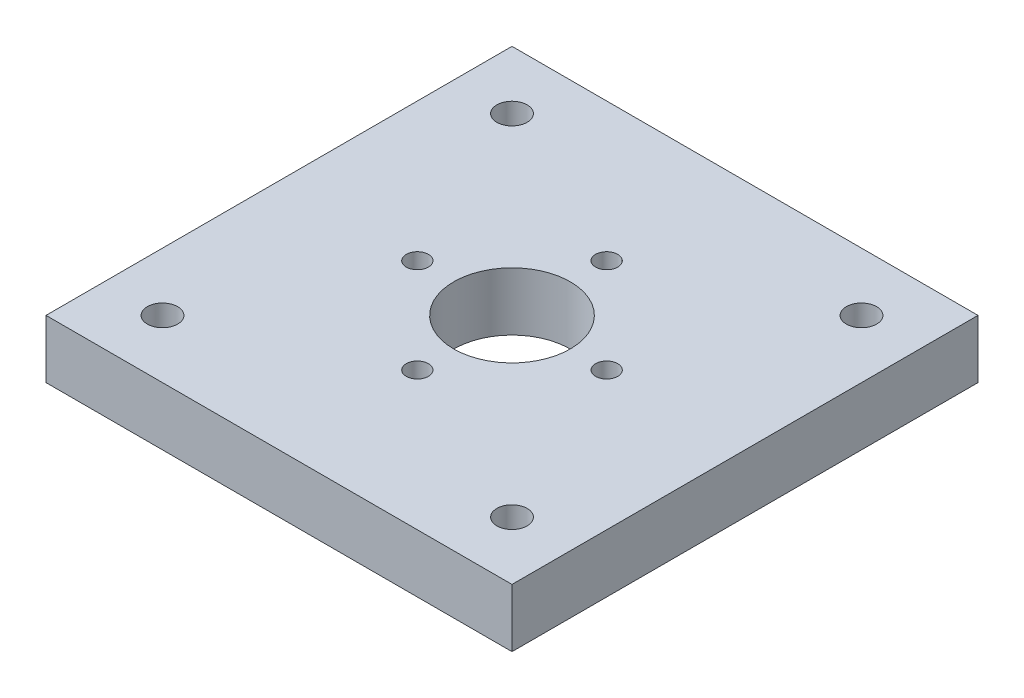
ISO-10303-21;
HEADER;
FILE_DESCRIPTION(('STEP AP214'),'2;1');
FILE_NAME('part.step','',(''),(''),'','','');
FILE_SCHEMA(('AUTOMOTIVE_DESIGN { 1 0 10303 214 1 1 1 1 }'));
ENDSEC;
DATA;
#1=APPLICATION_CONTEXT('core data for automotive mechanical design processes');
#2=APPLICATION_PROTOCOL_DEFINITION('international standard','automotive_design',2000,#1);
#3=PRODUCT_CONTEXT('',#1,'mechanical');
#4=PRODUCT('Part','Part','',(#3));
#5=PRODUCT_RELATED_PRODUCT_CATEGORY('part','',(#4));
#6=PRODUCT_DEFINITION_FORMATION('','',#4);
#7=PRODUCT_DEFINITION_CONTEXT('part definition',#1,'design');
#8=PRODUCT_DEFINITION('design','',#6,#7);
#9=PRODUCT_DEFINITION_SHAPE('','',#8);
#10=(LENGTH_UNIT() NAMED_UNIT(*) SI_UNIT(.MILLI.,.METRE.));
#11=(NAMED_UNIT(*) PLANE_ANGLE_UNIT() SI_UNIT($,.RADIAN.));
#12=(NAMED_UNIT(*) SI_UNIT($,.STERADIAN.) SOLID_ANGLE_UNIT());
#13=UNCERTAINTY_MEASURE_WITH_UNIT(LENGTH_MEASURE(1.E-05),#10,'distance_accuracy_value','');
#14=(GEOMETRIC_REPRESENTATION_CONTEXT(3) GLOBAL_UNCERTAINTY_ASSIGNED_CONTEXT((#13)) GLOBAL_UNIT_ASSIGNED_CONTEXT((#10,
#11,#12)) REPRESENTATION_CONTEXT('',''));
#15=CARTESIAN_POINT('',(0.,0.,0.));
#16=DIRECTION('',(0.,0.,1.));
#17=DIRECTION('',(1.,0.,0.));
#18=AXIS2_PLACEMENT_3D('',#15,#16,#17);
#19=CARTESIAN_POINT('',(0.,6.35,0.));
#20=DIRECTION('',(0.,-1.,0.));
#21=DIRECTION('',(0.,0.,-1.));
#22=AXIS2_PLACEMENT_3D('',#19,#20,#21);
#23=PLANE('',#22);
#24=DIRECTION('',(0.,0.,-1.));
#25=VECTOR('',#24,1.);
#26=CARTESIAN_POINT('',(50.8,6.35,50.8));
#27=LINE('',#26,#25);
#28=CARTESIAN_POINT('',(50.8,6.35,50.8));
#29=VERTEX_POINT('',#28);
#30=CARTESIAN_POINT('',(50.8,6.35,-50.8));
#31=VERTEX_POINT('',#30);
#32=EDGE_CURVE('E94',#29,#31,#27,.T.);
#33=ORIENTED_EDGE('',*,*,#32,.T.);
#34=DIRECTION('',(-1.,0.,0.));
#35=VECTOR('',#34,1.);
#36=CARTESIAN_POINT('',(-50.8,6.35,-50.8));
#37=LINE('',#36,#35);
#38=CARTESIAN_POINT('',(-50.8,6.35,-50.8));
#39=VERTEX_POINT('',#38);
#40=EDGE_CURVE('E89',#31,#39,#37,.T.);
#41=ORIENTED_EDGE('',*,*,#40,.T.);
#42=DIRECTION('',(0.,0.,1.));
#43=VECTOR('',#42,1.);
#44=CARTESIAN_POINT('',(-50.8,6.35,50.8));
#45=LINE('',#44,#43);
#46=CARTESIAN_POINT('',(-50.8,6.35,50.8));
#47=VERTEX_POINT('',#46);
#48=EDGE_CURVE('E92',#39,#47,#45,.T.);
#49=ORIENTED_EDGE('',*,*,#48,.T.);
#50=DIRECTION('',(1.,0.,0.));
#51=VECTOR('',#50,1.);
#52=CARTESIAN_POINT('',(-50.8,6.35,50.8));
#53=LINE('',#52,#51);
#54=EDGE_CURVE('E59',#47,#29,#53,.T.);
#55=ORIENTED_EDGE('',*,*,#54,.T.);
#56=EDGE_LOOP('',(#33,#41,#49,#55));
#57=FACE_BOUND('',#56,.T.);
#58=CARTESIAN_POINT('',(-38.1,6.35,-38.1));
#59=DIRECTION('',(0.,1.,0.));
#60=DIRECTION('',(0.,0.,1.));
#61=AXIS2_PLACEMENT_3D('',#58,#59,#60);
#62=CIRCLE('',#61,3.302);
#63=CARTESIAN_POINT('',(-38.1,6.35,-34.798));
#64=VERTEX_POINT('',#63);
#65=EDGE_CURVE('E109',#64,#64,#62,.T.);
#66=ORIENTED_EDGE('',*,*,#65,.F.);
#67=EDGE_LOOP('',(#66));
#68=FACE_BOUND('',#67,.T.);
#69=CARTESIAN_POINT('',(-38.1,6.35,38.1));
#70=DIRECTION('',(0.,1.,0.));
#71=DIRECTION('',(0.,0.,-1.));
#72=AXIS2_PLACEMENT_3D('',#69,#70,#71);
#73=CIRCLE('',#72,3.302);
#74=CARTESIAN_POINT('',(-38.1,6.35,34.798));
#75=VERTEX_POINT('',#74);
#76=EDGE_CURVE('E124',#75,#75,#73,.T.);
#77=ORIENTED_EDGE('',*,*,#76,.F.);
#78=EDGE_LOOP('',(#77));
#79=FACE_BOUND('',#78,.T.);
#80=CARTESIAN_POINT('',(38.1,6.35,38.1));
#81=DIRECTION('',(0.,1.,0.));
#82=DIRECTION('',(0.,0.,1.));
#83=AXIS2_PLACEMENT_3D('',#80,#81,#82);
#84=CIRCLE('',#83,3.302);
#85=CARTESIAN_POINT('',(38.1,6.35,41.402));
#86=VERTEX_POINT('',#85);
#87=EDGE_CURVE('E130',#86,#86,#84,.T.);
#88=ORIENTED_EDGE('',*,*,#87,.F.);
#89=EDGE_LOOP('',(#88));
#90=FACE_BOUND('',#89,.T.);
#91=CARTESIAN_POINT('',(38.1,6.35,-38.1));
#92=DIRECTION('',(0.,1.,0.));
#93=DIRECTION('',(0.,0.,-1.));
#94=AXIS2_PLACEMENT_3D('',#91,#92,#93);
#95=CIRCLE('',#94,3.302);
#96=CARTESIAN_POINT('',(38.1,6.35,-41.402));
#97=VERTEX_POINT('',#96);
#98=EDGE_CURVE('E136',#97,#97,#95,.T.);
#99=ORIENTED_EDGE('',*,*,#98,.F.);
#100=EDGE_LOOP('',(#99));
#101=FACE_BOUND('',#100,.T.);
#102=CARTESIAN_POINT('',(0.,6.35,0.));
#103=DIRECTION('',(0.,1.,0.));
#104=DIRECTION('',(0.,0.,1.));
#105=AXIS2_PLACEMENT_3D('',#102,#103,#104);
#106=CIRCLE('',#105,12.7);
#107=CARTESIAN_POINT('',(0.,6.35,12.7));
#108=VERTEX_POINT('',#107);
#109=EDGE_CURVE('E142',#108,#108,#106,.T.);
#110=ORIENTED_EDGE('',*,*,#109,.F.);
#111=EDGE_LOOP('',(#110));
#112=FACE_BOUND('',#111,.T.);
#113=CARTESIAN_POINT('',(0.,6.35,-20.6375));
#114=DIRECTION('',(0.,1.,0.));
#115=DIRECTION('',(0.,0.,1.));
#116=AXIS2_PLACEMENT_3D('',#113,#114,#115);
#117=CIRCLE('',#116,2.413);
#118=CARTESIAN_POINT('',(0.,6.35,-18.2245));
#119=VERTEX_POINT('',#118);
#120=EDGE_CURVE('E148',#119,#119,#117,.T.);
#121=ORIENTED_EDGE('',*,*,#120,.F.);
#122=EDGE_LOOP('',(#121));
#123=FACE_BOUND('',#122,.T.);
#124=CARTESIAN_POINT('',(0.,6.35,20.6375));
#125=DIRECTION('',(0.,1.,0.));
#126=DIRECTION('',(0.,0.,-1.));
#127=AXIS2_PLACEMENT_3D('',#124,#125,#126);
#128=CIRCLE('',#127,2.413);
#129=CARTESIAN_POINT('',(0.,6.35,18.2245));
#130=VERTEX_POINT('',#129);
#131=EDGE_CURVE('E154',#130,#130,#128,.T.);
#132=ORIENTED_EDGE('',*,*,#131,.F.);
#133=EDGE_LOOP('',(#132));
#134=FACE_BOUND('',#133,.T.);
#135=CARTESIAN_POINT('',(-20.6375,6.35,0.));
#136=DIRECTION('',(0.,1.,0.));
#137=DIRECTION('',(0.,0.,1.));
#138=AXIS2_PLACEMENT_3D('',#135,#136,#137);
#139=CIRCLE('',#138,2.413);
#140=CARTESIAN_POINT('',(-20.6375,6.35,2.413));
#141=VERTEX_POINT('',#140);
#142=EDGE_CURVE('E160',#141,#141,#139,.T.);
#143=ORIENTED_EDGE('',*,*,#142,.F.);
#144=EDGE_LOOP('',(#143));
#145=FACE_BOUND('',#144,.T.);
#146=CARTESIAN_POINT('',(20.6375,6.35,0.));
#147=DIRECTION('',(0.,1.,0.));
#148=DIRECTION('',(0.,0.,-1.));
#149=AXIS2_PLACEMENT_3D('',#146,#147,#148);
#150=CIRCLE('',#149,2.413);
#151=CARTESIAN_POINT('',(20.6375,6.35,-2.413));
#152=VERTEX_POINT('',#151);
#153=EDGE_CURVE('E166',#152,#152,#150,.T.);
#154=ORIENTED_EDGE('',*,*,#153,.F.);
#155=EDGE_LOOP('',(#154));
#156=FACE_BOUND('',#155,.T.);
#157=ADVANCED_FACE('F42',(#57,#68,#79,#90,#101,#112,#123,#134,#145,#156),#23,.F.);
#158=CARTESIAN_POINT('',(0.,-6.35,0.));
#159=DIRECTION('',(0.,-1.,0.));
#160=DIRECTION('',(0.,0.,-1.));
#161=AXIS2_PLACEMENT_3D('',#158,#159,#160);
#162=PLANE('',#161);
#163=CARTESIAN_POINT('',(-20.6375,-6.35,0.));
#164=DIRECTION('',(0.,1.,0.));
#165=DIRECTION('',(0.,0.,1.));
#166=AXIS2_PLACEMENT_3D('',#163,#164,#165);
#167=CIRCLE('',#166,2.413);
#168=CARTESIAN_POINT('',(-20.6375,-6.35,2.413));
#169=VERTEX_POINT('',#168);
#170=EDGE_CURVE('E163',#169,#169,#167,.T.);
#171=ORIENTED_EDGE('',*,*,#170,.T.);
#172=EDGE_LOOP('',(#171));
#173=FACE_BOUND('',#172,.T.);
#174=CARTESIAN_POINT('',(0.,-6.35,-20.6375));
#175=DIRECTION('',(0.,1.,0.));
#176=DIRECTION('',(0.,0.,1.));
#177=AXIS2_PLACEMENT_3D('',#174,#175,#176);
#178=CIRCLE('',#177,2.413);
#179=CARTESIAN_POINT('',(0.,-6.35,-18.2245));
#180=VERTEX_POINT('',#179);
#181=EDGE_CURVE('E151',#180,#180,#178,.T.);
#182=ORIENTED_EDGE('',*,*,#181,.T.);
#183=EDGE_LOOP('',(#182));
#184=FACE_BOUND('',#183,.T.);
#185=CARTESIAN_POINT('',(38.1,-6.35,-38.1));
#186=DIRECTION('',(0.,1.,0.));
#187=DIRECTION('',(0.,0.,-1.));
#188=AXIS2_PLACEMENT_3D('',#185,#186,#187);
#189=CIRCLE('',#188,3.302);
#190=CARTESIAN_POINT('',(38.1,-6.35,-41.402));
#191=VERTEX_POINT('',#190);
#192=EDGE_CURVE('E139',#191,#191,#189,.T.);
#193=ORIENTED_EDGE('',*,*,#192,.T.);
#194=EDGE_LOOP('',(#193));
#195=FACE_BOUND('',#194,.T.);
#196=CARTESIAN_POINT('',(-38.1,-6.35,38.1));
#197=DIRECTION('',(0.,1.,0.));
#198=DIRECTION('',(0.,0.,-1.));
#199=AXIS2_PLACEMENT_3D('',#196,#197,#198);
#200=CIRCLE('',#199,3.302);
#201=CARTESIAN_POINT('',(-38.1,-6.35,34.798));
#202=VERTEX_POINT('',#201);
#203=EDGE_CURVE('E127',#202,#202,#200,.T.);
#204=ORIENTED_EDGE('',*,*,#203,.T.);
#205=EDGE_LOOP('',(#204));
#206=FACE_BOUND('',#205,.T.);
#207=DIRECTION('',(0.,0.,-1.));
#208=VECTOR('',#207,1.);
#209=CARTESIAN_POINT('',(50.8,-6.35,50.8));
#210=LINE('',#209,#208);
#211=CARTESIAN_POINT('',(50.8,-6.35,50.8));
#212=VERTEX_POINT('',#211);
#213=CARTESIAN_POINT('',(50.8,-6.35,-50.8));
#214=VERTEX_POINT('',#213);
#215=EDGE_CURVE('E106',#212,#214,#210,.T.);
#216=ORIENTED_EDGE('',*,*,#215,.F.);
#217=DIRECTION('',(1.,0.,0.));
#218=VECTOR('',#217,1.);
#219=CARTESIAN_POINT('',(-50.8,-6.35,50.8));
#220=LINE('',#219,#218);
#221=CARTESIAN_POINT('',(-50.8,-6.35,50.8));
#222=VERTEX_POINT('',#221);
#223=EDGE_CURVE('E82',#222,#212,#220,.T.);
#224=ORIENTED_EDGE('',*,*,#223,.F.);
#225=DIRECTION('',(0.,0.,1.));
#226=VECTOR('',#225,1.);
#227=CARTESIAN_POINT('',(-50.8,-6.35,50.8));
#228=LINE('',#227,#226);
#229=CARTESIAN_POINT('',(-50.8,-6.35,-50.8));
#230=VERTEX_POINT('',#229);
#231=EDGE_CURVE('E76',#230,#222,#228,.T.);
#232=ORIENTED_EDGE('',*,*,#231,.F.);
#233=DIRECTION('',(-1.,0.,0.));
#234=VECTOR('',#233,1.);
#235=CARTESIAN_POINT('',(-50.8,-6.35,-50.8));
#236=LINE('',#235,#234);
#237=EDGE_CURVE('E98',#214,#230,#236,.T.);
#238=ORIENTED_EDGE('',*,*,#237,.F.);
#239=EDGE_LOOP('',(#216,#224,#232,#238));
#240=FACE_BOUND('',#239,.T.);
#241=CARTESIAN_POINT('',(-38.1,-6.35,-38.1));
#242=DIRECTION('',(0.,1.,0.));
#243=DIRECTION('',(0.,0.,1.));
#244=AXIS2_PLACEMENT_3D('',#241,#242,#243);
#245=CIRCLE('',#244,3.302);
#246=CARTESIAN_POINT('',(-38.1,-6.35,-34.798));
#247=VERTEX_POINT('',#246);
#248=EDGE_CURVE('E121',#247,#247,#245,.T.);
#249=ORIENTED_EDGE('',*,*,#248,.T.);
#250=EDGE_LOOP('',(#249));
#251=FACE_BOUND('',#250,.T.);
#252=CARTESIAN_POINT('',(38.1,-6.35,38.1));
#253=DIRECTION('',(0.,1.,0.));
#254=DIRECTION('',(0.,0.,1.));
#255=AXIS2_PLACEMENT_3D('',#252,#253,#254);
#256=CIRCLE('',#255,3.302);
#257=CARTESIAN_POINT('',(38.1,-6.35,41.402));
#258=VERTEX_POINT('',#257);
#259=EDGE_CURVE('E133',#258,#258,#256,.T.);
#260=ORIENTED_EDGE('',*,*,#259,.T.);
#261=EDGE_LOOP('',(#260));
#262=FACE_BOUND('',#261,.T.);
#263=CARTESIAN_POINT('',(0.,-6.35,0.));
#264=DIRECTION('',(0.,1.,0.));
#265=DIRECTION('',(0.,0.,1.));
#266=AXIS2_PLACEMENT_3D('',#263,#264,#265);
#267=CIRCLE('',#266,12.7);
#268=CARTESIAN_POINT('',(0.,-6.35,12.7));
#269=VERTEX_POINT('',#268);
#270=EDGE_CURVE('E145',#269,#269,#267,.T.);
#271=ORIENTED_EDGE('',*,*,#270,.T.);
#272=EDGE_LOOP('',(#271));
#273=FACE_BOUND('',#272,.T.);
#274=CARTESIAN_POINT('',(0.,-6.35,20.6375));
#275=DIRECTION('',(0.,1.,0.));
#276=DIRECTION('',(0.,0.,-1.));
#277=AXIS2_PLACEMENT_3D('',#274,#275,#276);
#278=CIRCLE('',#277,2.413);
#279=CARTESIAN_POINT('',(0.,-6.35,18.2245));
#280=VERTEX_POINT('',#279);
#281=EDGE_CURVE('E157',#280,#280,#278,.T.);
#282=ORIENTED_EDGE('',*,*,#281,.T.);
#283=EDGE_LOOP('',(#282));
#284=FACE_BOUND('',#283,.T.);
#285=CARTESIAN_POINT('',(20.6375,-6.35,0.));
#286=DIRECTION('',(0.,1.,0.));
#287=DIRECTION('',(0.,0.,-1.));
#288=AXIS2_PLACEMENT_3D('',#285,#286,#287);
#289=CIRCLE('',#288,2.413);
#290=CARTESIAN_POINT('',(20.6375,-6.35,-2.413));
#291=VERTEX_POINT('',#290);
#292=EDGE_CURVE('E169',#291,#291,#289,.T.);
#293=ORIENTED_EDGE('',*,*,#292,.T.);
#294=EDGE_LOOP('',(#293));
#295=FACE_BOUND('',#294,.T.);
#296=ADVANCED_FACE('F117',(#173,#184,#195,#206,#240,#251,#262,#273,#284,#295),#162,.T.);
#297=CARTESIAN_POINT('',(50.8,6.35,50.8));
#298=DIRECTION('',(-1.,0.,0.));
#299=DIRECTION('',(0.,0.,1.));
#300=AXIS2_PLACEMENT_3D('',#297,#298,#299);
#301=PLANE('',#300);
#302=ORIENTED_EDGE('',*,*,#215,.T.);
#303=DIRECTION('',(0.,-1.,0.));
#304=VECTOR('',#303,1.);
#305=CARTESIAN_POINT('',(50.8,6.35,-50.8));
#306=LINE('',#305,#304);
#307=EDGE_CURVE('E11',#31,#214,#306,.T.);
#308=ORIENTED_EDGE('',*,*,#307,.F.);
#309=ORIENTED_EDGE('',*,*,#32,.F.);
#310=DIRECTION('',(0.,-1.,0.));
#311=VECTOR('',#310,1.);
#312=CARTESIAN_POINT('',(50.8,6.35,50.8));
#313=LINE('',#312,#311);
#314=EDGE_CURVE('E102',#29,#212,#313,.T.);
#315=ORIENTED_EDGE('',*,*,#314,.T.);
#316=EDGE_LOOP('',(#302,#308,#309,#315));
#317=FACE_BOUND('',#316,.T.);
#318=ADVANCED_FACE('F44',(#317),#301,.F.);
#319=CARTESIAN_POINT('',(-50.8,6.35,-50.8));
#320=DIRECTION('',(0.,0.,1.));
#321=DIRECTION('',(1.,0.,0.));
#322=AXIS2_PLACEMENT_3D('',#319,#320,#321);
#323=PLANE('',#322);
#324=ORIENTED_EDGE('',*,*,#237,.T.);
#325=DIRECTION('',(0.,-1.,0.));
#326=VECTOR('',#325,1.);
#327=CARTESIAN_POINT('',(-50.8,6.35,-50.8));
#328=LINE('',#327,#326);
#329=EDGE_CURVE('E51',#39,#230,#328,.T.);
#330=ORIENTED_EDGE('',*,*,#329,.F.);
#331=ORIENTED_EDGE('',*,*,#40,.F.);
#332=ORIENTED_EDGE('',*,*,#307,.T.);
#333=EDGE_LOOP('',(#324,#330,#331,#332));
#334=FACE_BOUND('',#333,.T.);
#335=ADVANCED_FACE('F97',(#334),#323,.F.);
#336=CARTESIAN_POINT('',(-50.8,6.35,50.8));
#337=DIRECTION('',(1.,0.,0.));
#338=DIRECTION('',(0.,0.,-1.));
#339=AXIS2_PLACEMENT_3D('',#336,#337,#338);
#340=PLANE('',#339);
#341=ORIENTED_EDGE('',*,*,#231,.T.);
#342=DIRECTION('',(0.,-1.,0.));
#343=VECTOR('',#342,1.);
#344=CARTESIAN_POINT('',(-50.8,6.35,50.8));
#345=LINE('',#344,#343);
#346=EDGE_CURVE('E99',#47,#222,#345,.T.);
#347=ORIENTED_EDGE('',*,*,#346,.F.);
#348=ORIENTED_EDGE('',*,*,#48,.F.);
#349=ORIENTED_EDGE('',*,*,#329,.T.);
#350=EDGE_LOOP('',(#341,#347,#348,#349));
#351=FACE_BOUND('',#350,.T.);
#352=ADVANCED_FACE('F100',(#351),#340,.F.);
#353=CARTESIAN_POINT('',(-50.8,6.35,50.8));
#354=DIRECTION('',(0.,0.,-1.));
#355=DIRECTION('',(-1.,0.,0.));
#356=AXIS2_PLACEMENT_3D('',#353,#354,#355);
#357=PLANE('',#356);
#358=ORIENTED_EDGE('',*,*,#223,.T.);
#359=ORIENTED_EDGE('',*,*,#314,.F.);
#360=ORIENTED_EDGE('',*,*,#54,.F.);
#361=ORIENTED_EDGE('',*,*,#346,.T.);
#362=EDGE_LOOP('',(#358,#359,#360,#361));
#363=FACE_BOUND('',#362,.T.);
#364=ADVANCED_FACE('F114',(#363),#357,.F.);
#365=CARTESIAN_POINT('',(-38.1,6.35,-38.1));
#366=DIRECTION('',(0.,-1.,0.));
#367=DIRECTION('',(0.,0.,-1.));
#368=AXIS2_PLACEMENT_3D('',#365,#366,#367);
#369=CYLINDRICAL_SURFACE('',#368,3.302);
#370=ORIENTED_EDGE('',*,*,#65,.T.);
#371=EDGE_LOOP('',(#370));
#372=FACE_BOUND('',#371,.T.);
#373=ORIENTED_EDGE('',*,*,#248,.F.);
#374=EDGE_LOOP('',(#373));
#375=FACE_BOUND('',#374,.T.);
#376=ADVANCED_FACE('F186',(#372,#375),#369,.F.);
#377=CARTESIAN_POINT('',(-38.1,6.35,38.1));
#378=DIRECTION('',(0.,-1.,0.));
#379=DIRECTION('',(0.,0.,-1.));
#380=AXIS2_PLACEMENT_3D('',#377,#378,#379);
#381=CYLINDRICAL_SURFACE('',#380,3.302);
#382=ORIENTED_EDGE('',*,*,#76,.T.);
#383=EDGE_LOOP('',(#382));
#384=FACE_BOUND('',#383,.T.);
#385=ORIENTED_EDGE('',*,*,#203,.F.);
#386=EDGE_LOOP('',(#385));
#387=FACE_BOUND('',#386,.T.);
#388=ADVANCED_FACE('F231',(#384,#387),#381,.F.);
#389=CARTESIAN_POINT('',(38.1,6.35,38.1));
#390=DIRECTION('',(0.,-1.,0.));
#391=DIRECTION('',(0.,0.,-1.));
#392=AXIS2_PLACEMENT_3D('',#389,#390,#391);
#393=CYLINDRICAL_SURFACE('',#392,3.302);
#394=ORIENTED_EDGE('',*,*,#87,.T.);
#395=EDGE_LOOP('',(#394));
#396=FACE_BOUND('',#395,.T.);
#397=ORIENTED_EDGE('',*,*,#259,.F.);
#398=EDGE_LOOP('',(#397));
#399=FACE_BOUND('',#398,.T.);
#400=ADVANCED_FACE('F239',(#396,#399),#393,.F.);
#401=CARTESIAN_POINT('',(38.1,6.35,-38.1));
#402=DIRECTION('',(0.,-1.,0.));
#403=DIRECTION('',(0.,0.,-1.));
#404=AXIS2_PLACEMENT_3D('',#401,#402,#403);
#405=CYLINDRICAL_SURFACE('',#404,3.302);
#406=ORIENTED_EDGE('',*,*,#98,.T.);
#407=EDGE_LOOP('',(#406));
#408=FACE_BOUND('',#407,.T.);
#409=ORIENTED_EDGE('',*,*,#192,.F.);
#410=EDGE_LOOP('',(#409));
#411=FACE_BOUND('',#410,.T.);
#412=ADVANCED_FACE('F247',(#408,#411),#405,.F.);
#413=CARTESIAN_POINT('',(0.,6.35,0.));
#414=DIRECTION('',(0.,-1.,0.));
#415=DIRECTION('',(0.,0.,-1.));
#416=AXIS2_PLACEMENT_3D('',#413,#414,#415);
#417=CYLINDRICAL_SURFACE('',#416,12.7);
#418=ORIENTED_EDGE('',*,*,#109,.T.);
#419=EDGE_LOOP('',(#418));
#420=FACE_BOUND('',#419,.T.);
#421=ORIENTED_EDGE('',*,*,#270,.F.);
#422=EDGE_LOOP('',(#421));
#423=FACE_BOUND('',#422,.T.);
#424=ADVANCED_FACE('F256',(#420,#423),#417,.F.);
#425=CARTESIAN_POINT('',(0.,6.35,-20.6375));
#426=DIRECTION('',(0.,-1.,0.));
#427=DIRECTION('',(0.,0.,-1.));
#428=AXIS2_PLACEMENT_3D('',#425,#426,#427);
#429=CYLINDRICAL_SURFACE('',#428,2.413);
#430=ORIENTED_EDGE('',*,*,#120,.T.);
#431=EDGE_LOOP('',(#430));
#432=FACE_BOUND('',#431,.T.);
#433=ORIENTED_EDGE('',*,*,#181,.F.);
#434=EDGE_LOOP('',(#433));
#435=FACE_BOUND('',#434,.T.);
#436=ADVANCED_FACE('F265',(#432,#435),#429,.F.);
#437=CARTESIAN_POINT('',(0.,6.35,20.6375));
#438=DIRECTION('',(0.,-1.,0.));
#439=DIRECTION('',(0.,0.,-1.));
#440=AXIS2_PLACEMENT_3D('',#437,#438,#439);
#441=CYLINDRICAL_SURFACE('',#440,2.413);
#442=ORIENTED_EDGE('',*,*,#131,.T.);
#443=EDGE_LOOP('',(#442));
#444=FACE_BOUND('',#443,.T.);
#445=ORIENTED_EDGE('',*,*,#281,.F.);
#446=EDGE_LOOP('',(#445));
#447=FACE_BOUND('',#446,.T.);
#448=ADVANCED_FACE('F274',(#444,#447),#441,.F.);
#449=CARTESIAN_POINT('',(-20.6375,6.35,0.));
#450=DIRECTION('',(0.,-1.,0.));
#451=DIRECTION('',(0.,0.,-1.));
#452=AXIS2_PLACEMENT_3D('',#449,#450,#451);
#453=CYLINDRICAL_SURFACE('',#452,2.413);
#454=ORIENTED_EDGE('',*,*,#142,.T.);
#455=EDGE_LOOP('',(#454));
#456=FACE_BOUND('',#455,.T.);
#457=ORIENTED_EDGE('',*,*,#170,.F.);
#458=EDGE_LOOP('',(#457));
#459=FACE_BOUND('',#458,.T.);
#460=ADVANCED_FACE('F283',(#456,#459),#453,.F.);
#461=CARTESIAN_POINT('',(20.6375,6.35,0.));
#462=DIRECTION('',(0.,-1.,0.));
#463=DIRECTION('',(0.,0.,-1.));
#464=AXIS2_PLACEMENT_3D('',#461,#462,#463);
#465=CYLINDRICAL_SURFACE('',#464,2.413);
#466=ORIENTED_EDGE('',*,*,#153,.T.);
#467=EDGE_LOOP('',(#466));
#468=FACE_BOUND('',#467,.T.);
#469=ORIENTED_EDGE('',*,*,#292,.F.);
#470=EDGE_LOOP('',(#469));
#471=FACE_BOUND('',#470,.T.);
#472=ADVANCED_FACE('F175',(#468,#471),#465,.F.);
#473=CLOSED_SHELL('',(#157,#296,#318,#335,#352,#364,#376,#388,#400,#412,#424,#436,#448,#460,#472));
#474=MANIFOLD_SOLID_BREP('B2',#473);
#475=ADVANCED_BREP_SHAPE_REPRESENTATION('',(#18,#474),#14);
#476=SHAPE_DEFINITION_REPRESENTATION(#9,#475);
ENDSEC;
END-ISO-10303-21;
